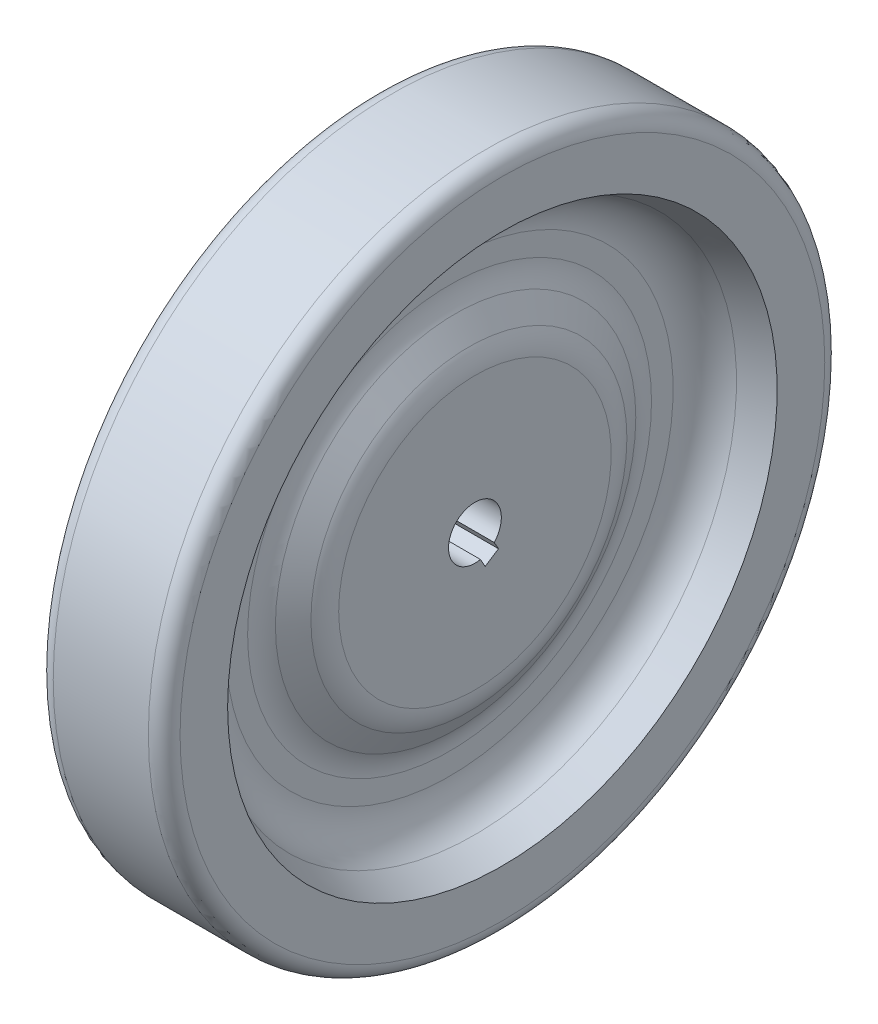
ISO-10303-21;
HEADER;
FILE_DESCRIPTION(('STEP AP214'),'2;1');
FILE_NAME('part.step','',(''),(''),'','','');
FILE_SCHEMA(('AUTOMOTIVE_DESIGN { 1 0 10303 214 1 1 1 1 }'));
ENDSEC;
DATA;
#1=APPLICATION_CONTEXT('core data for automotive mechanical design processes');
#2=APPLICATION_PROTOCOL_DEFINITION('international standard','automotive_design',2000,#1);
#3=PRODUCT_CONTEXT('',#1,'mechanical');
#4=PRODUCT('Part','Part','',(#3));
#5=PRODUCT_RELATED_PRODUCT_CATEGORY('part','',(#4));
#6=PRODUCT_DEFINITION_FORMATION('','',#4);
#7=PRODUCT_DEFINITION_CONTEXT('part definition',#1,'design');
#8=PRODUCT_DEFINITION('design','',#6,#7);
#9=PRODUCT_DEFINITION_SHAPE('','',#8);
#10=(LENGTH_UNIT() NAMED_UNIT(*) SI_UNIT(.MILLI.,.METRE.));
#11=(NAMED_UNIT(*) PLANE_ANGLE_UNIT() SI_UNIT($,.RADIAN.));
#12=(NAMED_UNIT(*) SI_UNIT($,.STERADIAN.) SOLID_ANGLE_UNIT());
#13=UNCERTAINTY_MEASURE_WITH_UNIT(LENGTH_MEASURE(1.E-05),#10,'distance_accuracy_value','');
#14=(GEOMETRIC_REPRESENTATION_CONTEXT(3) GLOBAL_UNCERTAINTY_ASSIGNED_CONTEXT((#13)) GLOBAL_UNIT_ASSIGNED_CONTEXT((#10,
#11,#12)) REPRESENTATION_CONTEXT('',''));
#15=CARTESIAN_POINT('',(0.,0.,0.));
#16=DIRECTION('',(0.,0.,1.));
#17=DIRECTION('',(1.,0.,0.));
#18=AXIS2_PLACEMENT_3D('',#15,#16,#17);
#19=CARTESIAN_POINT('',(-10.795,0.,0.));
#20=DIRECTION('',(1.,0.,0.));
#21=DIRECTION('',(0.,0.,-1.));
#22=AXIS2_PLACEMENT_3D('',#19,#20,#21);
#23=PLANE('',#22);
#24=DIRECTION('',(0.,0.871154690836768,0.491008660446122));
#25=VECTOR('',#24,1.);
#26=CARTESIAN_POINT('',(-10.795,1.16921437268929,-2.07443710755854));
#27=LINE('',#26,#25);
#28=CARTESIAN_POINT('',(-10.795,-7.71044449677782,-7.07927660687603));
#29=VERTEX_POINT('',#28);
#30=CARTESIAN_POINT('',(-10.795,-5.42707521988149,-5.792301857448));
#31=VERTEX_POINT('',#30);
#32=EDGE_CURVE('E87',#29,#31,#27,.T.);
#33=ORIENTED_EDGE('',*,*,#32,.T.);
#34=CARTESIAN_POINT('',(-10.795,-3.1641356201817E-12,-2.66453525910038E-12));
#35=DIRECTION('',(1.,0.,0.));
#36=DIRECTION('',(0.,0.,-1.));
#37=AXIS2_PLACEMENT_3D('',#34,#35,#36);
#38=CIRCLE('',#37,7.9374999999979);
#39=CARTESIAN_POINT('',(-10.795,-7.76550396525615,-1.6434276423379));
#40=VERTEX_POINT('',#39);
#41=EDGE_CURVE('E113',#31,#40,#38,.T.);
#42=ORIENTED_EDGE('',*,*,#41,.T.);
#43=DIRECTION('',(0.,-0.871154690836768,-0.491008660446123));
#44=VECTOR('',#43,1.);
#45=CARTESIAN_POINT('',(-10.795,-1.16921437268537,2.07443710755157));
#46=LINE('',#45,#44);
#47=CARTESIAN_POINT('',(-10.795,-10.3012400323076,-3.07264381097486));
#48=VERTEX_POINT('',#47);
#49=EDGE_CURVE('E108',#40,#48,#46,.T.);
#50=ORIENTED_EDGE('',*,*,#49,.T.);
#51=DIRECTION('',(0.,0.542995443535533,-0.839735641913364));
#52=VECTOR('',#51,1.);
#53=CARTESIAN_POINT('',(-10.795,-8.66502215499391,-5.60303423298254));
#54=LINE('',#53,#52);
#55=EDGE_CURVE('E93',#48,#29,#54,.T.);
#56=ORIENTED_EDGE('',*,*,#55,.T.);
#57=EDGE_LOOP('',(#33,#42,#50,#56));
#58=FACE_BOUND('',#57,.T.);
#59=CARTESIAN_POINT('',(-10.795,0.,0.));
#60=DIRECTION('',(-1.,0.,0.));
#61=DIRECTION('',(0.,0.,1.));
#62=AXIS2_PLACEMENT_3D('',#59,#60,#61);
#63=CIRCLE('',#62,40.9323036451548);
#64=CARTESIAN_POINT('',(-10.795,0.,40.9323036451548));
#65=VERTEX_POINT('',#64);
#66=EDGE_CURVE('E186',#65,#65,#63,.T.);
#67=ORIENTED_EDGE('',*,*,#66,.T.);
#68=EDGE_LOOP('',(#67));
#69=FACE_BOUND('',#68,.T.);
#70=ADVANCED_FACE('F41',(#58,#69),#23,.F.);
#71=CARTESIAN_POINT('',(1.905,0.,0.));
#72=DIRECTION('',(-1.,0.,0.));
#73=DIRECTION('',(0.,0.,1.));
#74=AXIS2_PLACEMENT_3D('',#71,#72,#73);
#75=TOROIDAL_SURFACE('',#74,40.9323036451549,12.7);
#76=ORIENTED_EDGE('',*,*,#66,.F.);
#77=EDGE_LOOP('',(#76));
#78=FACE_BOUND('',#77,.T.);
#79=CARTESIAN_POINT('',(-8.98516015654929,0.,0.));
#80=DIRECTION('',(-1.,0.,0.));
#81=DIRECTION('',(0.,0.,1.));
#82=AXIS2_PLACEMENT_3D('',#79,#80,#81);
#83=CIRCLE('',#82,47.4663997390845);
#84=CARTESIAN_POINT('',(-8.98516015654929,0.,47.4663997390845));
#85=VERTEX_POINT('',#84);
#86=EDGE_CURVE('E182',#85,#85,#83,.T.);
#87=ORIENTED_EDGE('',*,*,#86,.T.);
#88=EDGE_LOOP('',(#87));
#89=FACE_BOUND('',#88,.T.);
#90=ADVANCED_FACE('F221',(#78,#89),#75,.T.);
#91=CARTESIAN_POINT('',(-4.98483984345071,0.,0.));
#92=DIRECTION('',(1.,0.,0.));
#93=DIRECTION('',(0.,0.,-1.));
#94=AXIS2_PLACEMENT_3D('',#91,#92,#93);
#95=CONICAL_SURFACE('',#94,54.1336002609155,1.03037682652431);
#96=ORIENTED_EDGE('',*,*,#86,.F.);
#97=EDGE_LOOP('',(#96));
#98=FACE_BOUND('',#97,.T.);
#99=CARTESIAN_POINT('',(-4.98483984345071,0.,0.));
#100=DIRECTION('',(-1.,0.,0.));
#101=DIRECTION('',(0.,0.,1.));
#102=AXIS2_PLACEMENT_3D('',#99,#100,#101);
#103=CIRCLE('',#102,54.1336002609155);
#104=CARTESIAN_POINT('',(-4.98483984345071,0.,54.1336002609155));
#105=VERTEX_POINT('',#104);
#106=EDGE_CURVE('E178',#105,#105,#103,.T.);
#107=ORIENTED_EDGE('',*,*,#106,.T.);
#108=EDGE_LOOP('',(#107));
#109=FACE_BOUND('',#108,.T.);
#110=ADVANCED_FACE('F225',(#98,#109),#95,.T.);
#111=CARTESIAN_POINT('',(-15.875,0.,0.));
#112=DIRECTION('',(-1.,0.,0.));
#113=DIRECTION('',(0.,0.,1.));
#114=AXIS2_PLACEMENT_3D('',#111,#112,#113);
#115=TOROIDAL_SURFACE('',#114,60.6676963548451,12.7);
#116=ORIENTED_EDGE('',*,*,#106,.F.);
#117=EDGE_LOOP('',(#116));
#118=FACE_BOUND('',#117,.T.);
#119=CARTESIAN_POINT('',(-3.175,0.,0.));
#120=DIRECTION('',(-1.,0.,0.));
#121=DIRECTION('',(0.,0.,1.));
#122=AXIS2_PLACEMENT_3D('',#119,#120,#121);
#123=CIRCLE('',#122,60.6676963548451);
#124=CARTESIAN_POINT('',(-3.175,0.,60.6676963548451));
#125=VERTEX_POINT('',#124);
#126=EDGE_CURVE('E174',#125,#125,#123,.T.);
#127=ORIENTED_EDGE('',*,*,#126,.T.);
#128=EDGE_LOOP('',(#127));
#129=FACE_BOUND('',#128,.T.);
#130=ADVANCED_FACE('F230',(#118,#129),#115,.F.);
#131=CARTESIAN_POINT('',(-3.175,60.6676963548452,0.));
#132=DIRECTION('',(1.,0.,0.));
#133=DIRECTION('',(0.,0.,-1.));
#134=AXIS2_PLACEMENT_3D('',#131,#132,#133);
#135=PLANE('',#134);
#136=ORIENTED_EDGE('',*,*,#126,.F.);
#137=EDGE_LOOP('',(#136));
#138=FACE_BOUND('',#137,.T.);
#139=CARTESIAN_POINT('',(-3.175,0.,0.));
#140=DIRECTION('',(-1.,0.,0.));
#141=DIRECTION('',(0.,0.,1.));
#142=AXIS2_PLACEMENT_3D('',#139,#140,#141);
#143=CIRCLE('',#142,67.1708671128673);
#144=CARTESIAN_POINT('',(-3.175,0.,67.1708671128673));
#145=VERTEX_POINT('',#144);
#146=EDGE_CURVE('E170',#145,#145,#143,.T.);
#147=ORIENTED_EDGE('',*,*,#146,.T.);
#148=EDGE_LOOP('',(#147));
#149=FACE_BOUND('',#148,.T.);
#150=ADVANCED_FACE('F238',(#138,#149),#135,.F.);
#151=CARTESIAN_POINT('',(-15.875,0.,0.));
#152=DIRECTION('',(-1.,0.,0.));
#153=DIRECTION('',(0.,0.,1.));
#154=AXIS2_PLACEMENT_3D('',#151,#152,#153);
#155=TOROIDAL_SURFACE('',#154,67.1708671128673,12.7);
#156=ORIENTED_EDGE('',*,*,#146,.F.);
#157=EDGE_LOOP('',(#156));
#158=FACE_BOUND('',#157,.T.);
#159=CARTESIAN_POINT('',(-10.6361867527211,0.,0.));
#160=DIRECTION('',(-1.,0.,0.));
#161=DIRECTION('',(0.,0.,1.));
#162=AXIS2_PLACEMENT_3D('',#159,#160,#161);
#163=CIRCLE('',#162,78.74);
#164=CARTESIAN_POINT('',(-10.6361867527211,0.,78.74));
#165=VERTEX_POINT('',#164);
#166=EDGE_CURVE('E166',#165,#165,#163,.T.);
#167=ORIENTED_EDGE('',*,*,#166,.T.);
#168=EDGE_LOOP('',(#167));
#169=FACE_BOUND('',#168,.T.);
#170=ADVANCED_FACE('F242',(#158,#169),#155,.F.);
#171=CARTESIAN_POINT('',(-19.05,0.,0.));
#172=DIRECTION('',(-1.,0.,0.));
#173=DIRECTION('',(0.,0.,1.));
#174=AXIS2_PLACEMENT_3D('',#171,#172,#173);
#175=CONICAL_SURFACE('',#174,82.55,0.425202194242927);
#176=ORIENTED_EDGE('',*,*,#166,.F.);
#177=EDGE_LOOP('',(#176));
#178=FACE_BOUND('',#177,.T.);
#179=CARTESIAN_POINT('',(-19.05,0.,0.));
#180=DIRECTION('',(-1.,0.,0.));
#181=DIRECTION('',(0.,0.,1.));
#182=AXIS2_PLACEMENT_3D('',#179,#180,#181);
#183=CIRCLE('',#182,82.55);
#184=CARTESIAN_POINT('',(-19.05,0.,82.55));
#185=VERTEX_POINT('',#184);
#186=EDGE_CURVE('E163',#185,#185,#183,.T.);
#187=ORIENTED_EDGE('',*,*,#186,.T.);
#188=EDGE_LOOP('',(#187));
#189=FACE_BOUND('',#188,.T.);
#190=ADVANCED_FACE('F246',(#178,#189),#175,.F.);
#191=CARTESIAN_POINT('',(-19.05,82.55,0.));
#192=DIRECTION('',(1.,0.,0.));
#193=DIRECTION('',(0.,0.,-1.));
#194=AXIS2_PLACEMENT_3D('',#191,#192,#193);
#195=PLANE('',#194);
#196=ORIENTED_EDGE('',*,*,#186,.F.);
#197=EDGE_LOOP('',(#196));
#198=FACE_BOUND('',#197,.T.);
#199=CARTESIAN_POINT('',(-19.05,0.,0.));
#200=DIRECTION('',(-1.,0.,0.));
#201=DIRECTION('',(0.,0.,1.));
#202=AXIS2_PLACEMENT_3D('',#199,#200,#201);
#203=CIRCLE('',#202,96.8375);
#204=CARTESIAN_POINT('',(-19.05,0.,96.8375));
#205=VERTEX_POINT('',#204);
#206=EDGE_CURVE('E159',#205,#205,#203,.T.);
#207=ORIENTED_EDGE('',*,*,#206,.T.);
#208=EDGE_LOOP('',(#207));
#209=FACE_BOUND('',#208,.T.);
#210=ADVANCED_FACE('F250',(#198,#209),#195,.F.);
#211=CARTESIAN_POINT('',(-14.2875,0.,0.));
#212=DIRECTION('',(-1.,0.,0.));
#213=DIRECTION('',(0.,0.,1.));
#214=AXIS2_PLACEMENT_3D('',#211,#212,#213);
#215=TOROIDAL_SURFACE('',#214,96.8375,4.7625);
#216=ORIENTED_EDGE('',*,*,#206,.F.);
#217=EDGE_LOOP('',(#216));
#218=FACE_BOUND('',#217,.T.);
#219=CARTESIAN_POINT('',(-14.2875,0.,0.));
#220=DIRECTION('',(-1.,0.,0.));
#221=DIRECTION('',(0.,0.,1.));
#222=AXIS2_PLACEMENT_3D('',#219,#220,#221);
#223=CIRCLE('',#222,101.6);
#224=CARTESIAN_POINT('',(-14.2875,0.,101.6));
#225=VERTEX_POINT('',#224);
#226=EDGE_CURVE('E155',#225,#225,#223,.T.);
#227=ORIENTED_EDGE('',*,*,#226,.T.);
#228=EDGE_LOOP('',(#227));
#229=FACE_BOUND('',#228,.T.);
#230=ADVANCED_FACE('F254',(#218,#229),#215,.T.);
#231=CARTESIAN_POINT('',(-10.795,0.,0.));
#232=DIRECTION('',(-1.,0.,0.));
#233=DIRECTION('',(0.,0.,1.));
#234=AXIS2_PLACEMENT_3D('',#231,#232,#233);
#235=CYLINDRICAL_SURFACE('',#234,101.6);
#236=ORIENTED_EDGE('',*,*,#226,.F.);
#237=EDGE_LOOP('',(#236));
#238=FACE_BOUND('',#237,.T.);
#239=CARTESIAN_POINT('',(14.2875,0.,0.));
#240=DIRECTION('',(-1.,0.,0.));
#241=DIRECTION('',(0.,0.,1.));
#242=AXIS2_PLACEMENT_3D('',#239,#240,#241);
#243=CIRCLE('',#242,101.6);
#244=CARTESIAN_POINT('',(14.2875,0.,101.6));
#245=VERTEX_POINT('',#244);
#246=EDGE_CURVE('E151',#245,#245,#243,.T.);
#247=ORIENTED_EDGE('',*,*,#246,.T.);
#248=EDGE_LOOP('',(#247));
#249=FACE_BOUND('',#248,.T.);
#250=ADVANCED_FACE('F258',(#238,#249),#235,.T.);
#251=CARTESIAN_POINT('',(14.2875,0.,0.));
#252=DIRECTION('',(-1.,0.,0.));
#253=DIRECTION('',(0.,0.,1.));
#254=AXIS2_PLACEMENT_3D('',#251,#252,#253);
#255=TOROIDAL_SURFACE('',#254,96.8375,4.7625);
#256=ORIENTED_EDGE('',*,*,#246,.F.);
#257=EDGE_LOOP('',(#256));
#258=FACE_BOUND('',#257,.T.);
#259=CARTESIAN_POINT('',(19.05,0.,0.));
#260=DIRECTION('',(-1.,0.,0.));
#261=DIRECTION('',(0.,0.,1.));
#262=AXIS2_PLACEMENT_3D('',#259,#260,#261);
#263=CIRCLE('',#262,96.8375);
#264=CARTESIAN_POINT('',(19.05,0.,96.8375));
#265=VERTEX_POINT('',#264);
#266=EDGE_CURVE('E147',#265,#265,#263,.T.);
#267=ORIENTED_EDGE('',*,*,#266,.T.);
#268=EDGE_LOOP('',(#267));
#269=FACE_BOUND('',#268,.T.);
#270=ADVANCED_FACE('F262',(#258,#269),#255,.T.);
#271=CARTESIAN_POINT('',(19.05,82.55,0.));
#272=DIRECTION('',(-1.,0.,0.));
#273=DIRECTION('',(0.,0.,1.));
#274=AXIS2_PLACEMENT_3D('',#271,#272,#273);
#275=PLANE('',#274);
#276=ORIENTED_EDGE('',*,*,#266,.F.);
#277=EDGE_LOOP('',(#276));
#278=FACE_BOUND('',#277,.T.);
#279=CARTESIAN_POINT('',(19.05,0.,0.));
#280=DIRECTION('',(-1.,0.,0.));
#281=DIRECTION('',(0.,0.,1.));
#282=AXIS2_PLACEMENT_3D('',#279,#280,#281);
#283=CIRCLE('',#282,82.55);
#284=CARTESIAN_POINT('',(19.05,0.,82.55));
#285=VERTEX_POINT('',#284);
#286=EDGE_CURVE('E143',#285,#285,#283,.T.);
#287=ORIENTED_EDGE('',*,*,#286,.T.);
#288=EDGE_LOOP('',(#287));
#289=FACE_BOUND('',#288,.T.);
#290=ADVANCED_FACE('F266',(#278,#289),#275,.F.);
#291=CARTESIAN_POINT('',(10.6361867527211,0.,0.));
#292=DIRECTION('',(1.,0.,0.));
#293=DIRECTION('',(0.,0.,-1.));
#294=AXIS2_PLACEMENT_3D('',#291,#292,#293);
#295=CONICAL_SURFACE('',#294,78.74,0.425202194242927);
#296=ORIENTED_EDGE('',*,*,#286,.F.);
#297=EDGE_LOOP('',(#296));
#298=FACE_BOUND('',#297,.T.);
#299=CARTESIAN_POINT('',(10.6361867527211,0.,0.));
#300=DIRECTION('',(-1.,0.,0.));
#301=DIRECTION('',(0.,0.,1.));
#302=AXIS2_PLACEMENT_3D('',#299,#300,#301);
#303=CIRCLE('',#302,78.74);
#304=CARTESIAN_POINT('',(10.6361867527211,0.,78.74));
#305=VERTEX_POINT('',#304);
#306=EDGE_CURVE('E139',#305,#305,#303,.T.);
#307=ORIENTED_EDGE('',*,*,#306,.T.);
#308=EDGE_LOOP('',(#307));
#309=FACE_BOUND('',#308,.T.);
#310=ADVANCED_FACE('F270',(#298,#309),#295,.F.);
#311=CARTESIAN_POINT('',(15.875,0.,0.));
#312=DIRECTION('',(-1.,0.,0.));
#313=DIRECTION('',(0.,0.,1.));
#314=AXIS2_PLACEMENT_3D('',#311,#312,#313);
#315=TOROIDAL_SURFACE('',#314,67.1708671128673,12.7);
#316=ORIENTED_EDGE('',*,*,#306,.F.);
#317=EDGE_LOOP('',(#316));
#318=FACE_BOUND('',#317,.T.);
#319=CARTESIAN_POINT('',(3.175,0.,0.));
#320=DIRECTION('',(-1.,0.,0.));
#321=DIRECTION('',(0.,0.,1.));
#322=AXIS2_PLACEMENT_3D('',#319,#320,#321);
#323=CIRCLE('',#322,67.1708671128673);
#324=CARTESIAN_POINT('',(3.175,0.,67.1708671128673));
#325=VERTEX_POINT('',#324);
#326=EDGE_CURVE('E135',#325,#325,#323,.T.);
#327=ORIENTED_EDGE('',*,*,#326,.T.);
#328=EDGE_LOOP('',(#327));
#329=FACE_BOUND('',#328,.T.);
#330=ADVANCED_FACE('F274',(#318,#329),#315,.F.);
#331=CARTESIAN_POINT('',(3.175,60.6676963548452,0.));
#332=DIRECTION('',(-1.,0.,0.));
#333=DIRECTION('',(0.,0.,1.));
#334=AXIS2_PLACEMENT_3D('',#331,#332,#333);
#335=PLANE('',#334);
#336=ORIENTED_EDGE('',*,*,#326,.F.);
#337=EDGE_LOOP('',(#336));
#338=FACE_BOUND('',#337,.T.);
#339=CARTESIAN_POINT('',(3.175,0.,0.));
#340=DIRECTION('',(-1.,0.,0.));
#341=DIRECTION('',(0.,0.,1.));
#342=AXIS2_PLACEMENT_3D('',#339,#340,#341);
#343=CIRCLE('',#342,60.6676963548452);
#344=CARTESIAN_POINT('',(3.175,0.,60.6676963548452));
#345=VERTEX_POINT('',#344);
#346=EDGE_CURVE('E131',#345,#345,#343,.T.);
#347=ORIENTED_EDGE('',*,*,#346,.T.);
#348=EDGE_LOOP('',(#347));
#349=FACE_BOUND('',#348,.T.);
#350=ADVANCED_FACE('F278',(#338,#349),#335,.F.);
#351=CARTESIAN_POINT('',(15.875,0.,0.));
#352=DIRECTION('',(-1.,0.,0.));
#353=DIRECTION('',(0.,0.,1.));
#354=AXIS2_PLACEMENT_3D('',#351,#352,#353);
#355=TOROIDAL_SURFACE('',#354,60.6676963548451,12.7);
#356=ORIENTED_EDGE('',*,*,#346,.F.);
#357=EDGE_LOOP('',(#356));
#358=FACE_BOUND('',#357,.T.);
#359=CARTESIAN_POINT('',(4.98483984345071,0.,0.));
#360=DIRECTION('',(-1.,0.,0.));
#361=DIRECTION('',(0.,0.,1.));
#362=AXIS2_PLACEMENT_3D('',#359,#360,#361);
#363=CIRCLE('',#362,54.1336002609155);
#364=CARTESIAN_POINT('',(4.98483984345071,0.,54.1336002609155));
#365=VERTEX_POINT('',#364);
#366=EDGE_CURVE('E127',#365,#365,#363,.T.);
#367=ORIENTED_EDGE('',*,*,#366,.T.);
#368=EDGE_LOOP('',(#367));
#369=FACE_BOUND('',#368,.T.);
#370=ADVANCED_FACE('F282',(#358,#369),#355,.F.);
#371=CARTESIAN_POINT('',(8.98516015654929,0.,0.));
#372=DIRECTION('',(-1.,0.,0.));
#373=DIRECTION('',(0.,0.,1.));
#374=AXIS2_PLACEMENT_3D('',#371,#372,#373);
#375=CONICAL_SURFACE('',#374,47.4663997390845,1.03037682652431);
#376=ORIENTED_EDGE('',*,*,#366,.F.);
#377=EDGE_LOOP('',(#376));
#378=FACE_BOUND('',#377,.T.);
#379=CARTESIAN_POINT('',(8.98516015654929,0.,0.));
#380=DIRECTION('',(-1.,0.,0.));
#381=DIRECTION('',(0.,0.,1.));
#382=AXIS2_PLACEMENT_3D('',#379,#380,#381);
#383=CIRCLE('',#382,47.4663997390845);
#384=CARTESIAN_POINT('',(8.98516015654929,0.,47.4663997390845));
#385=VERTEX_POINT('',#384);
#386=EDGE_CURVE('E123',#385,#385,#383,.T.);
#387=ORIENTED_EDGE('',*,*,#386,.T.);
#388=EDGE_LOOP('',(#387));
#389=FACE_BOUND('',#388,.T.);
#390=ADVANCED_FACE('F286',(#378,#389),#375,.T.);
#391=CARTESIAN_POINT('',(-1.905,0.,0.));
#392=DIRECTION('',(-1.,0.,0.));
#393=DIRECTION('',(0.,0.,1.));
#394=AXIS2_PLACEMENT_3D('',#391,#392,#393);
#395=TOROIDAL_SURFACE('',#394,40.9323036451549,12.7);
#396=ORIENTED_EDGE('',*,*,#386,.F.);
#397=EDGE_LOOP('',(#396));
#398=FACE_BOUND('',#397,.T.);
#399=CARTESIAN_POINT('',(10.795,0.,0.));
#400=DIRECTION('',(-1.,0.,0.));
#401=DIRECTION('',(0.,0.,1.));
#402=AXIS2_PLACEMENT_3D('',#399,#400,#401);
#403=CIRCLE('',#402,40.9323036451549);
#404=CARTESIAN_POINT('',(10.795,0.,40.9323036451549));
#405=VERTEX_POINT('',#404);
#406=EDGE_CURVE('E119',#405,#405,#403,.T.);
#407=ORIENTED_EDGE('',*,*,#406,.T.);
#408=EDGE_LOOP('',(#407));
#409=FACE_BOUND('',#408,.T.);
#410=ADVANCED_FACE('F217',(#398,#409),#395,.T.);
#411=CARTESIAN_POINT('',(10.795,0.,0.));
#412=DIRECTION('',(-1.,0.,0.));
#413=DIRECTION('',(0.,0.,1.));
#414=AXIS2_PLACEMENT_3D('',#411,#412,#413);
#415=PLANE('',#414);
#416=DIRECTION('',(0.,0.871154690836768,0.491008660446123));
#417=VECTOR('',#416,1.);
#418=CARTESIAN_POINT('',(10.795,-1.16921437268537,2.07443710755157));
#419=LINE('',#418,#417);
#420=CARTESIAN_POINT('',(10.795,-10.3012400323076,-3.07264381097486));
#421=VERTEX_POINT('',#420);
#422=CARTESIAN_POINT('',(10.795,-7.76550396525615,-1.6434276423379));
#423=VERTEX_POINT('',#422);
#424=EDGE_CURVE('E49',#421,#423,#419,.T.);
#425=ORIENTED_EDGE('',*,*,#424,.T.);
#426=CARTESIAN_POINT('',(10.795,-3.1641356201817E-12,-2.66453525910038E-12));
#427=DIRECTION('',(-1.,0.,0.));
#428=DIRECTION('',(0.,0.,1.));
#429=AXIS2_PLACEMENT_3D('',#426,#427,#428);
#430=CIRCLE('',#429,7.9374999999979);
#431=CARTESIAN_POINT('',(10.795,-5.42707521988149,-5.792301857448));
#432=VERTEX_POINT('',#431);
#433=EDGE_CURVE('E11',#423,#432,#430,.T.);
#434=ORIENTED_EDGE('',*,*,#433,.T.);
#435=DIRECTION('',(0.,-0.871154690836768,-0.491008660446122));
#436=VECTOR('',#435,1.);
#437=CARTESIAN_POINT('',(10.795,1.16921437268929,-2.07443710755854));
#438=LINE('',#437,#436);
#439=CARTESIAN_POINT('',(10.795,-7.71044449677782,-7.07927660687603));
#440=VERTEX_POINT('',#439);
#441=EDGE_CURVE('E190',#432,#440,#438,.T.);
#442=ORIENTED_EDGE('',*,*,#441,.T.);
#443=DIRECTION('',(0.,-0.542995443535533,0.839735641913364));
#444=VECTOR('',#443,1.);
#445=CARTESIAN_POINT('',(10.795,-8.66502215499391,-5.60303423298254));
#446=LINE('',#445,#444);
#447=EDGE_CURVE('E101',#440,#421,#446,.T.);
#448=ORIENTED_EDGE('',*,*,#447,.T.);
#449=EDGE_LOOP('',(#425,#434,#442,#448));
#450=FACE_BOUND('',#449,.T.);
#451=ORIENTED_EDGE('',*,*,#406,.F.);
#452=EDGE_LOOP('',(#451));
#453=FACE_BOUND('',#452,.T.);
#454=ADVANCED_FACE('F198',(#450,#453),#415,.F.);
#455=CARTESIAN_POINT('',(19.05,-3.1641356201817E-12,-2.66453525910038E-12));
#456=DIRECTION('',(-1.,0.,0.));
#457=DIRECTION('',(0.,0.,1.));
#458=AXIS2_PLACEMENT_3D('',#455,#456,#457);
#459=CYLINDRICAL_SURFACE('',#458,7.9374999999979);
#460=DIRECTION('',(-1.,0.,0.));
#461=VECTOR('',#460,1.);
#462=CARTESIAN_POINT('',(19.05,-5.42707521988149,-5.792301857448));
#463=LINE('',#462,#461);
#464=EDGE_CURVE('E58',#432,#31,#463,.T.);
#465=ORIENTED_EDGE('',*,*,#464,.F.);
#466=ORIENTED_EDGE('',*,*,#433,.F.);
#467=DIRECTION('',(-1.,0.,0.));
#468=VECTOR('',#467,1.);
#469=CARTESIAN_POINT('',(19.05,-7.76550396525615,-1.6434276423379));
#470=LINE('',#469,#468);
#471=EDGE_CURVE('E94',#423,#40,#470,.T.);
#472=ORIENTED_EDGE('',*,*,#471,.T.);
#473=ORIENTED_EDGE('',*,*,#41,.F.);
#474=EDGE_LOOP('',(#465,#466,#472,#473));
#475=FACE_BOUND('',#474,.T.);
#476=ADVANCED_FACE('F209',(#475),#459,.F.);
#477=CARTESIAN_POINT('',(19.05,-7.76550396525615,-1.6434276423379));
#478=DIRECTION('',(0.,-0.491008660446123,0.871154690836768));
#479=DIRECTION('',(0.,-0.871154690836768,-0.491008660446123));
#480=AXIS2_PLACEMENT_3D('',#477,#478,#479);
#481=PLANE('',#480);
#482=ORIENTED_EDGE('',*,*,#471,.F.);
#483=ORIENTED_EDGE('',*,*,#424,.F.);
#484=DIRECTION('',(-1.,0.,0.));
#485=VECTOR('',#484,1.);
#486=CARTESIAN_POINT('',(19.05,-10.3012400323076,-3.07264381097486));
#487=LINE('',#486,#485);
#488=EDGE_CURVE('E104',#421,#48,#487,.T.);
#489=ORIENTED_EDGE('',*,*,#488,.T.);
#490=ORIENTED_EDGE('',*,*,#49,.F.);
#491=EDGE_LOOP('',(#482,#483,#489,#490));
#492=FACE_BOUND('',#491,.T.);
#493=ADVANCED_FACE('F202',(#492),#481,.F.);
#494=CARTESIAN_POINT('',(19.05,-7.71044449677782,-7.07927660687603));
#495=DIRECTION('',(0.,-0.839735641913364,-0.542995443535533));
#496=DIRECTION('',(0.,0.542995443535533,-0.839735641913364));
#497=AXIS2_PLACEMENT_3D('',#494,#495,#496);
#498=PLANE('',#497);
#499=ORIENTED_EDGE('',*,*,#488,.F.);
#500=ORIENTED_EDGE('',*,*,#447,.F.);
#501=DIRECTION('',(-1.,0.,0.));
#502=VECTOR('',#501,1.);
#503=CARTESIAN_POINT('',(19.05,-7.71044449677782,-7.07927660687603));
#504=LINE('',#503,#502);
#505=EDGE_CURVE('E66',#440,#29,#504,.T.);
#506=ORIENTED_EDGE('',*,*,#505,.T.);
#507=ORIENTED_EDGE('',*,*,#55,.F.);
#508=EDGE_LOOP('',(#499,#500,#506,#507));
#509=FACE_BOUND('',#508,.T.);
#510=ADVANCED_FACE('F98',(#509),#498,.F.);
#511=CARTESIAN_POINT('',(19.05,-7.71044449677782,-7.07927660687603));
#512=DIRECTION('',(0.,0.491008660446122,-0.871154690836768));
#513=DIRECTION('',(0.,0.871154690836768,0.491008660446122));
#514=AXIS2_PLACEMENT_3D('',#511,#512,#513);
#515=PLANE('',#514);
#516=ORIENTED_EDGE('',*,*,#505,.F.);
#517=ORIENTED_EDGE('',*,*,#441,.F.);
#518=ORIENTED_EDGE('',*,*,#464,.T.);
#519=ORIENTED_EDGE('',*,*,#32,.F.);
#520=EDGE_LOOP('',(#516,#517,#518,#519));
#521=FACE_BOUND('',#520,.T.);
#522=ADVANCED_FACE('F88',(#521),#515,.F.);
#523=CLOSED_SHELL('',(#70,#90,#110,#130,#150,#170,#190,#210,#230,#250,#270,#290,#310,#330,#350,
#370,#390,#410,#454,#476,#493,#510,#522));
#524=MANIFOLD_SOLID_BREP('B2',#523);
#525=ADVANCED_BREP_SHAPE_REPRESENTATION('',(#18,#524),#14);
#526=SHAPE_DEFINITION_REPRESENTATION(#9,#525);
ENDSEC;
END-ISO-10303-21;
